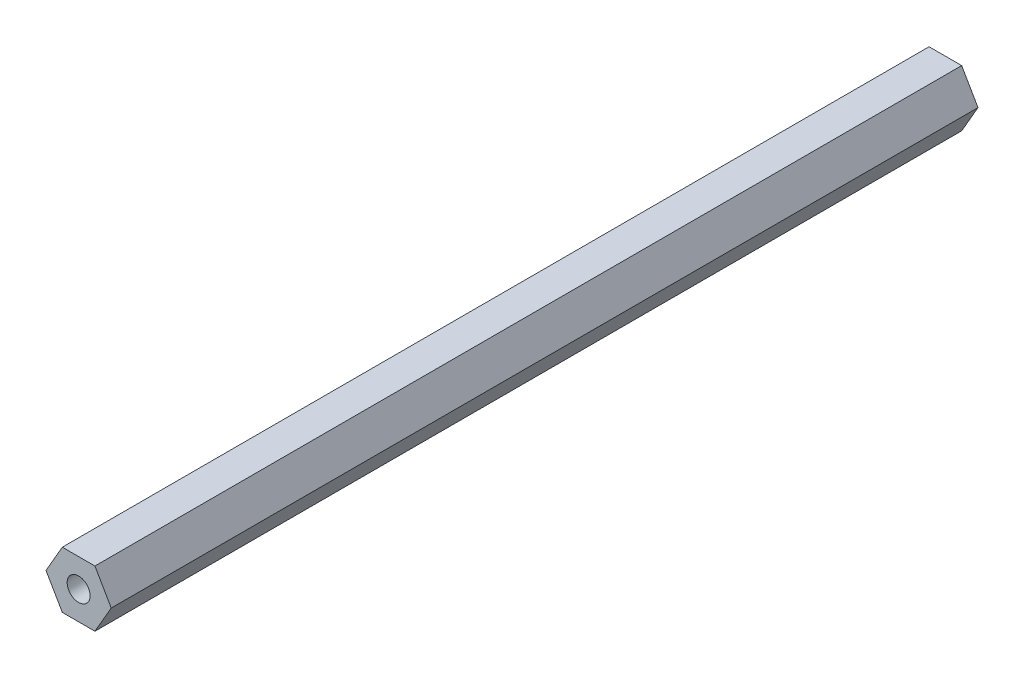
ISO-10303-21;
HEADER;
FILE_DESCRIPTION(('STEP AP214'),'2;1');
FILE_NAME('part.step','',(''),(''),'','','');
FILE_SCHEMA(('AUTOMOTIVE_DESIGN { 1 0 10303 214 1 1 1 1 }'));
ENDSEC;
DATA;
#1=APPLICATION_CONTEXT('core data for automotive mechanical design processes');
#2=APPLICATION_PROTOCOL_DEFINITION('international standard','automotive_design',2000,#1);
#3=PRODUCT_CONTEXT('',#1,'mechanical');
#4=PRODUCT('Part','Part','',(#3));
#5=PRODUCT_RELATED_PRODUCT_CATEGORY('part','',(#4));
#6=PRODUCT_DEFINITION_FORMATION('','',#4);
#7=PRODUCT_DEFINITION_CONTEXT('part definition',#1,'design');
#8=PRODUCT_DEFINITION('design','',#6,#7);
#9=PRODUCT_DEFINITION_SHAPE('','',#8);
#10=(LENGTH_UNIT() NAMED_UNIT(*) SI_UNIT(.MILLI.,.METRE.));
#11=(NAMED_UNIT(*) PLANE_ANGLE_UNIT() SI_UNIT($,.RADIAN.));
#12=(NAMED_UNIT(*) SI_UNIT($,.STERADIAN.) SOLID_ANGLE_UNIT());
#13=UNCERTAINTY_MEASURE_WITH_UNIT(LENGTH_MEASURE(1.E-05),#10,'distance_accuracy_value','');
#14=(GEOMETRIC_REPRESENTATION_CONTEXT(3) GLOBAL_UNCERTAINTY_ASSIGNED_CONTEXT((#13)) GLOBAL_UNIT_ASSIGNED_CONTEXT((#10,
#11,#12)) REPRESENTATION_CONTEXT('',''));
#15=CARTESIAN_POINT('',(0.,0.,0.));
#16=DIRECTION('',(0.,0.,1.));
#17=DIRECTION('',(1.,0.,0.));
#18=AXIS2_PLACEMENT_3D('',#15,#16,#17);
#19=CARTESIAN_POINT('',(0.,0.,194.82435));
#20=DIRECTION('',(0.,0.,1.));
#21=DIRECTION('',(1.,0.,0.));
#22=AXIS2_PLACEMENT_3D('',#19,#20,#21);
#23=PLANE('',#22);
#24=DIRECTION('',(0.5,0.866025403784439,0.));
#25=VECTOR('',#24,1.);
#26=CARTESIAN_POINT('',(3.66617420935412,-6.35,194.82435));
#27=LINE('',#26,#25);
#28=CARTESIAN_POINT('',(3.66617420935412,-6.35,194.82435));
#29=VERTEX_POINT('',#28);
#30=CARTESIAN_POINT('',(7.33234841870825,0.,194.82435));
#31=VERTEX_POINT('',#30);
#32=EDGE_CURVE('E130',#29,#31,#27,.T.);
#33=ORIENTED_EDGE('',*,*,#32,.T.);
#34=DIRECTION('',(-0.5,0.866025403784439,0.));
#35=VECTOR('',#34,1.);
#36=CARTESIAN_POINT('',(7.33234841870825,0.,194.82435));
#37=LINE('',#36,#35);
#38=CARTESIAN_POINT('',(3.66617420935412,6.35,194.82435));
#39=VERTEX_POINT('',#38);
#40=EDGE_CURVE('E88',#31,#39,#37,.T.);
#41=ORIENTED_EDGE('',*,*,#40,.T.);
#42=DIRECTION('',(-1.,0.,0.));
#43=VECTOR('',#42,1.);
#44=CARTESIAN_POINT('',(3.66617420935412,6.35,194.82435));
#45=LINE('',#44,#43);
#46=CARTESIAN_POINT('',(-3.66617420935412,6.35,194.82435));
#47=VERTEX_POINT('',#46);
#48=EDGE_CURVE('E101',#39,#47,#45,.T.);
#49=ORIENTED_EDGE('',*,*,#48,.T.);
#50=DIRECTION('',(-0.5,-0.866025403784438,0.));
#51=VECTOR('',#50,1.);
#52=CARTESIAN_POINT('',(-3.66617420935412,6.35,194.82435));
#53=LINE('',#52,#51);
#54=CARTESIAN_POINT('',(-7.33234841870825,0.,194.82435));
#55=VERTEX_POINT('',#54);
#56=EDGE_CURVE('E95',#47,#55,#53,.T.);
#57=ORIENTED_EDGE('',*,*,#56,.T.);
#58=DIRECTION('',(0.5,-0.866025403784439,0.));
#59=VECTOR('',#58,1.);
#60=CARTESIAN_POINT('',(-7.33234841870825,0.,194.82435));
#61=LINE('',#60,#59);
#62=CARTESIAN_POINT('',(-3.66617420935413,-6.35,194.82435));
#63=VERTEX_POINT('',#62);
#64=EDGE_CURVE('E99',#55,#63,#61,.T.);
#65=ORIENTED_EDGE('',*,*,#64,.T.);
#66=DIRECTION('',(1.,0.,0.));
#67=VECTOR('',#66,1.);
#68=CARTESIAN_POINT('',(-3.66617420935413,-6.35,194.82435));
#69=LINE('',#68,#67);
#70=EDGE_CURVE('E51',#63,#29,#69,.T.);
#71=ORIENTED_EDGE('',*,*,#70,.T.);
#72=EDGE_LOOP('',(#33,#41,#49,#57,#65,#71));
#73=FACE_BOUND('',#72,.T.);
#74=CARTESIAN_POINT('',(0.,0.,194.82435));
#75=DIRECTION('',(0.,0.,1.));
#76=DIRECTION('',(1.,0.,0.));
#77=AXIS2_PLACEMENT_3D('',#74,#75,#76);
#78=CIRCLE('',#77,2.5796875);
#79=CARTESIAN_POINT('',(2.5796875,0.,194.82435));
#80=VERTEX_POINT('',#79);
#81=EDGE_CURVE('E123',#80,#80,#78,.T.);
#82=ORIENTED_EDGE('',*,*,#81,.F.);
#83=EDGE_LOOP('',(#82));
#84=FACE_BOUND('',#83,.T.);
#85=ADVANCED_FACE('F34',(#73,#84),#23,.T.);
#86=CARTESIAN_POINT('',(0.,0.,0.));
#87=DIRECTION('',(0.,0.,1.));
#88=DIRECTION('',(1.,0.,0.));
#89=AXIS2_PLACEMENT_3D('',#86,#87,#88);
#90=PLANE('',#89);
#91=DIRECTION('',(0.5,0.866025403784439,0.));
#92=VECTOR('',#91,1.);
#93=CARTESIAN_POINT('',(3.66617420935412,-6.35,0.));
#94=LINE('',#93,#92);
#95=CARTESIAN_POINT('',(3.66617420935412,-6.35,0.));
#96=VERTEX_POINT('',#95);
#97=CARTESIAN_POINT('',(7.33234841870825,0.,0.));
#98=VERTEX_POINT('',#97);
#99=EDGE_CURVE('E119',#96,#98,#94,.T.);
#100=ORIENTED_EDGE('',*,*,#99,.F.);
#101=DIRECTION('',(1.,0.,0.));
#102=VECTOR('',#101,1.);
#103=CARTESIAN_POINT('',(-3.66617420935413,-6.35,0.));
#104=LINE('',#103,#102);
#105=CARTESIAN_POINT('',(-3.66617420935413,-6.35,0.));
#106=VERTEX_POINT('',#105);
#107=EDGE_CURVE('E80',#106,#96,#104,.T.);
#108=ORIENTED_EDGE('',*,*,#107,.F.);
#109=DIRECTION('',(0.5,-0.866025403784439,0.));
#110=VECTOR('',#109,1.);
#111=CARTESIAN_POINT('',(-7.33234841870825,0.,0.));
#112=LINE('',#111,#110);
#113=CARTESIAN_POINT('',(-7.33234841870825,0.,0.));
#114=VERTEX_POINT('',#113);
#115=EDGE_CURVE('E74',#114,#106,#112,.T.);
#116=ORIENTED_EDGE('',*,*,#115,.F.);
#117=DIRECTION('',(-0.5,-0.866025403784438,0.));
#118=VECTOR('',#117,1.);
#119=CARTESIAN_POINT('',(-3.66617420935412,6.35,0.));
#120=LINE('',#119,#118);
#121=CARTESIAN_POINT('',(-3.66617420935412,6.35,0.));
#122=VERTEX_POINT('',#121);
#123=EDGE_CURVE('E109',#122,#114,#120,.T.);
#124=ORIENTED_EDGE('',*,*,#123,.F.);
#125=DIRECTION('',(-1.,0.,0.));
#126=VECTOR('',#125,1.);
#127=CARTESIAN_POINT('',(3.66617420935412,6.35,0.));
#128=LINE('',#127,#126);
#129=CARTESIAN_POINT('',(3.66617420935412,6.35,0.));
#130=VERTEX_POINT('',#129);
#131=EDGE_CURVE('E125',#130,#122,#128,.T.);
#132=ORIENTED_EDGE('',*,*,#131,.F.);
#133=DIRECTION('',(-0.5,0.866025403784439,0.));
#134=VECTOR('',#133,1.);
#135=CARTESIAN_POINT('',(7.33234841870825,0.,0.));
#136=LINE('',#135,#134);
#137=EDGE_CURVE('E122',#98,#130,#136,.T.);
#138=ORIENTED_EDGE('',*,*,#137,.F.);
#139=EDGE_LOOP('',(#100,#108,#116,#124,#132,#138));
#140=FACE_BOUND('',#139,.T.);
#141=CARTESIAN_POINT('',(0.,0.,0.));
#142=DIRECTION('',(0.,0.,1.));
#143=DIRECTION('',(1.,0.,0.));
#144=AXIS2_PLACEMENT_3D('',#141,#142,#143);
#145=CIRCLE('',#144,2.5796875);
#146=CARTESIAN_POINT('',(2.5796875,0.,0.));
#147=VERTEX_POINT('',#146);
#148=EDGE_CURVE('E223',#147,#147,#145,.T.);
#149=ORIENTED_EDGE('',*,*,#148,.T.);
#150=EDGE_LOOP('',(#149));
#151=FACE_BOUND('',#150,.T.);
#152=ADVANCED_FACE('F139',(#140,#151),#90,.F.);
#153=CARTESIAN_POINT('',(3.66617420935412,-6.35,194.82435));
#154=DIRECTION('',(-0.866025403784439,0.5,0.));
#155=DIRECTION('',(-0.5,-0.866025403784439,0.));
#156=AXIS2_PLACEMENT_3D('',#153,#154,#155);
#157=PLANE('',#156);
#158=ORIENTED_EDGE('',*,*,#99,.T.);
#159=DIRECTION('',(0.,0.,-1.));
#160=VECTOR('',#159,1.);
#161=CARTESIAN_POINT('',(7.33234841870825,0.,194.82435));
#162=LINE('',#161,#160);
#163=EDGE_CURVE('E11',#31,#98,#162,.T.);
#164=ORIENTED_EDGE('',*,*,#163,.F.);
#165=ORIENTED_EDGE('',*,*,#32,.F.);
#166=DIRECTION('',(0.,0.,-1.));
#167=VECTOR('',#166,1.);
#168=CARTESIAN_POINT('',(3.66617420935412,-6.35,194.82435));
#169=LINE('',#168,#167);
#170=EDGE_CURVE('E115',#29,#96,#169,.T.);
#171=ORIENTED_EDGE('',*,*,#170,.T.);
#172=EDGE_LOOP('',(#158,#164,#165,#171));
#173=FACE_BOUND('',#172,.T.);
#174=ADVANCED_FACE('F36',(#173),#157,.F.);
#175=CARTESIAN_POINT('',(7.33234841870825,0.,194.82435));
#176=DIRECTION('',(-0.866025403784439,-0.5,0.));
#177=DIRECTION('',(0.5,-0.866025403784439,0.));
#178=AXIS2_PLACEMENT_3D('',#175,#176,#177);
#179=PLANE('',#178);
#180=ORIENTED_EDGE('',*,*,#137,.T.);
#181=DIRECTION('',(0.,0.,-1.));
#182=VECTOR('',#181,1.);
#183=CARTESIAN_POINT('',(3.66617420935412,6.35,194.82435));
#184=LINE('',#183,#182);
#185=EDGE_CURVE('E43',#39,#130,#184,.T.);
#186=ORIENTED_EDGE('',*,*,#185,.F.);
#187=ORIENTED_EDGE('',*,*,#40,.F.);
#188=ORIENTED_EDGE('',*,*,#163,.T.);
#189=EDGE_LOOP('',(#180,#186,#187,#188));
#190=FACE_BOUND('',#189,.T.);
#191=ADVANCED_FACE('F164',(#190),#179,.F.);
#192=CARTESIAN_POINT('',(3.66617420935412,6.35,194.82435));
#193=DIRECTION('',(0.,-1.,0.));
#194=DIRECTION('',(1.,0.,0.));
#195=AXIS2_PLACEMENT_3D('',#192,#193,#194);
#196=PLANE('',#195);
#197=ORIENTED_EDGE('',*,*,#131,.T.);
#198=DIRECTION('',(0.,0.,-1.));
#199=VECTOR('',#198,1.);
#200=CARTESIAN_POINT('',(-3.66617420935412,6.35,194.82435));
#201=LINE('',#200,#199);
#202=EDGE_CURVE('E110',#47,#122,#201,.T.);
#203=ORIENTED_EDGE('',*,*,#202,.F.);
#204=ORIENTED_EDGE('',*,*,#48,.F.);
#205=ORIENTED_EDGE('',*,*,#185,.T.);
#206=EDGE_LOOP('',(#197,#203,#204,#205));
#207=FACE_BOUND('',#206,.T.);
#208=ADVANCED_FACE('F136',(#207),#196,.F.);
#209=CARTESIAN_POINT('',(-3.66617420935412,6.35,194.82435));
#210=DIRECTION('',(0.866025403784438,-0.5,0.));
#211=DIRECTION('',(0.5,0.866025403784439,0.));
#212=AXIS2_PLACEMENT_3D('',#209,#210,#211);
#213=PLANE('',#212);
#214=ORIENTED_EDGE('',*,*,#123,.T.);
#215=DIRECTION('',(0.,0.,-1.));
#216=VECTOR('',#215,1.);
#217=CARTESIAN_POINT('',(-7.33234841870825,0.,194.82435));
#218=LINE('',#217,#216);
#219=EDGE_CURVE('E106',#55,#114,#218,.T.);
#220=ORIENTED_EDGE('',*,*,#219,.F.);
#221=ORIENTED_EDGE('',*,*,#56,.F.);
#222=ORIENTED_EDGE('',*,*,#202,.T.);
#223=EDGE_LOOP('',(#214,#220,#221,#222));
#224=FACE_BOUND('',#223,.T.);
#225=ADVANCED_FACE('F107',(#224),#213,.F.);
#226=CARTESIAN_POINT('',(-7.33234841870825,0.,194.82435));
#227=DIRECTION('',(0.866025403784439,0.5,0.));
#228=DIRECTION('',(-0.5,0.866025403784439,0.));
#229=AXIS2_PLACEMENT_3D('',#226,#227,#228);
#230=PLANE('',#229);
#231=ORIENTED_EDGE('',*,*,#115,.T.);
#232=DIRECTION('',(0.,0.,-1.));
#233=VECTOR('',#232,1.);
#234=CARTESIAN_POINT('',(-3.66617420935413,-6.35,194.82435));
#235=LINE('',#234,#233);
#236=EDGE_CURVE('E111',#63,#106,#235,.T.);
#237=ORIENTED_EDGE('',*,*,#236,.F.);
#238=ORIENTED_EDGE('',*,*,#64,.F.);
#239=ORIENTED_EDGE('',*,*,#219,.T.);
#240=EDGE_LOOP('',(#231,#237,#238,#239));
#241=FACE_BOUND('',#240,.T.);
#242=ADVANCED_FACE('F113',(#241),#230,.F.);
#243=CARTESIAN_POINT('',(-3.66617420935413,-6.35,194.82435));
#244=DIRECTION('',(0.,1.,0.));
#245=DIRECTION('',(-1.,0.,0.));
#246=AXIS2_PLACEMENT_3D('',#243,#244,#245);
#247=PLANE('',#246);
#248=ORIENTED_EDGE('',*,*,#107,.T.);
#249=ORIENTED_EDGE('',*,*,#170,.F.);
#250=ORIENTED_EDGE('',*,*,#70,.F.);
#251=ORIENTED_EDGE('',*,*,#236,.T.);
#252=EDGE_LOOP('',(#248,#249,#250,#251));
#253=FACE_BOUND('',#252,.T.);
#254=ADVANCED_FACE('F144',(#253),#247,.F.);
#255=CARTESIAN_POINT('',(0.,0.,194.82435));
#256=DIRECTION('',(0.,0.,-1.));
#257=DIRECTION('',(-1.,0.,0.));
#258=AXIS2_PLACEMENT_3D('',#255,#256,#257);
#259=CYLINDRICAL_SURFACE('',#258,2.5796875);
#260=ORIENTED_EDGE('',*,*,#81,.T.);
#261=EDGE_LOOP('',(#260));
#262=FACE_BOUND('',#261,.T.);
#263=ORIENTED_EDGE('',*,*,#148,.F.);
#264=EDGE_LOOP('',(#263));
#265=FACE_BOUND('',#264,.T.);
#266=ADVANCED_FACE('F146',(#262,#265),#259,.F.);
#267=CLOSED_SHELL('',(#85,#152,#174,#191,#208,#225,#242,#254,#266));
#268=MANIFOLD_SOLID_BREP('B2',#267);
#269=ADVANCED_BREP_SHAPE_REPRESENTATION('',(#18,#268),#14);
#270=SHAPE_DEFINITION_REPRESENTATION(#9,#269);
ENDSEC;
END-ISO-10303-21;
